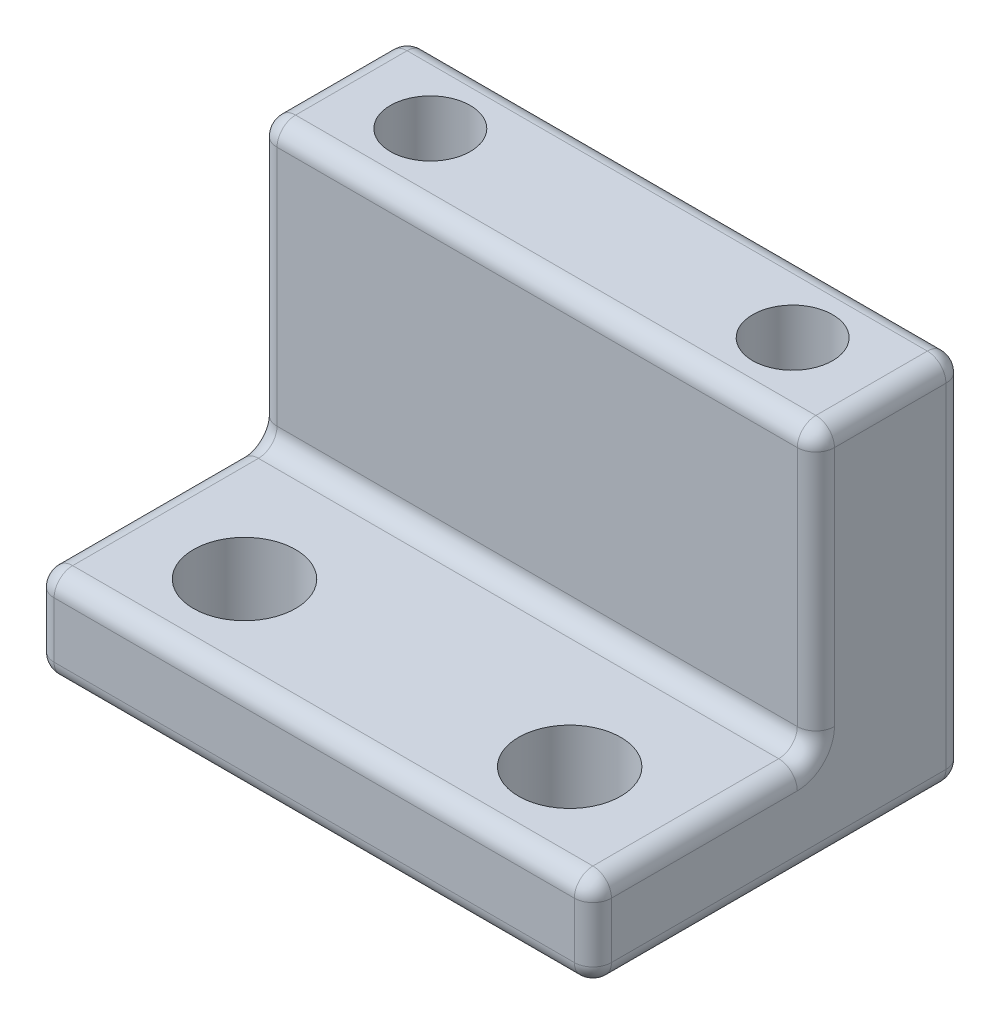
ISO-10303-21;
HEADER;
FILE_DESCRIPTION(('STEP AP214'),'2;1');
FILE_NAME('part.step','',(''),(''),'','','');
FILE_SCHEMA(('AUTOMOTIVE_DESIGN { 1 0 10303 214 1 1 1 1 }'));
ENDSEC;
DATA;
#1=APPLICATION_CONTEXT('core data for automotive mechanical design processes');
#2=APPLICATION_PROTOCOL_DEFINITION('international standard','automotive_design',2000,#1);
#3=PRODUCT_CONTEXT('',#1,'mechanical');
#4=PRODUCT('Part','Part','',(#3));
#5=PRODUCT_RELATED_PRODUCT_CATEGORY('part','',(#4));
#6=PRODUCT_DEFINITION_FORMATION('','',#4);
#7=PRODUCT_DEFINITION_CONTEXT('part definition',#1,'design');
#8=PRODUCT_DEFINITION('design','',#6,#7);
#9=PRODUCT_DEFINITION_SHAPE('','',#8);
#10=(LENGTH_UNIT() NAMED_UNIT(*) SI_UNIT(.MILLI.,.METRE.));
#11=(NAMED_UNIT(*) PLANE_ANGLE_UNIT() SI_UNIT($,.RADIAN.));
#12=(NAMED_UNIT(*) SI_UNIT($,.STERADIAN.) SOLID_ANGLE_UNIT());
#13=UNCERTAINTY_MEASURE_WITH_UNIT(LENGTH_MEASURE(1.E-05),#10,'distance_accuracy_value','');
#14=(GEOMETRIC_REPRESENTATION_CONTEXT(3) GLOBAL_UNCERTAINTY_ASSIGNED_CONTEXT((#13)) GLOBAL_UNIT_ASSIGNED_CONTEXT((#10,
#11,#12)) REPRESENTATION_CONTEXT('',''));
#15=CARTESIAN_POINT('',(0.,0.,0.));
#16=DIRECTION('',(0.,0.,1.));
#17=DIRECTION('',(1.,0.,0.));
#18=AXIS2_PLACEMENT_3D('',#15,#16,#17);
#19=CARTESIAN_POINT('',(0.,5.,0.));
#20=DIRECTION('',(0.,-1.,0.));
#21=DIRECTION('',(0.,0.,-1.));
#22=AXIS2_PLACEMENT_3D('',#19,#20,#21);
#23=PLANE('',#22);
#24=DIRECTION('',(1.,0.,0.));
#25=VECTOR('',#24,1.);
#26=CARTESIAN_POINT('',(0.,5.,-1.));
#27=LINE('',#26,#25);
#28=CARTESIAN_POINT('',(1.,5.,-1.));
#29=VERTEX_POINT('',#28);
#30=CARTESIAN_POINT('',(29.,5.,-1.));
#31=VERTEX_POINT('',#30);
#32=EDGE_CURVE('E185',#29,#31,#27,.T.);
#33=ORIENTED_EDGE('',*,*,#32,.T.);
#34=DIRECTION('',(0.,0.,-1.));
#35=VECTOR('',#34,1.);
#36=CARTESIAN_POINT('',(29.,5.,0.));
#37=LINE('',#36,#35);
#38=CARTESIAN_POINT('',(29.,5.,-11.));
#39=VERTEX_POINT('',#38);
#40=EDGE_CURVE('E180',#31,#39,#37,.T.);
#41=ORIENTED_EDGE('',*,*,#40,.T.);
#42=DIRECTION('',(1.,0.,0.));
#43=VECTOR('',#42,1.);
#44=CARTESIAN_POINT('',(0.,5.,-11.));
#45=LINE('',#44,#43);
#46=CARTESIAN_POINT('',(1.,5.,-11.));
#47=VERTEX_POINT('',#46);
#48=EDGE_CURVE('E172',#39,#47,#45,.F.);
#49=ORIENTED_EDGE('',*,*,#48,.T.);
#50=DIRECTION('',(0.,0.,1.));
#51=VECTOR('',#50,1.);
#52=CARTESIAN_POINT('',(1.,5.,0.));
#53=LINE('',#52,#51);
#54=EDGE_CURVE('E177',#47,#29,#53,.T.);
#55=ORIENTED_EDGE('',*,*,#54,.T.);
#56=EDGE_LOOP('',(#33,#41,#49,#55));
#57=FACE_BOUND('',#56,.T.);
#58=CARTESIAN_POINT('',(23.75,5.,-5.));
#59=DIRECTION('',(0.,1.,0.));
#60=DIRECTION('',(0.,0.,1.));
#61=AXIS2_PLACEMENT_3D('',#58,#59,#60);
#62=CIRCLE('',#61,2.75);
#63=CARTESIAN_POINT('',(23.75,5.,-2.25));
#64=VERTEX_POINT('',#63);
#65=EDGE_CURVE('E474',#64,#64,#62,.T.);
#66=ORIENTED_EDGE('',*,*,#65,.F.);
#67=EDGE_LOOP('',(#66));
#68=FACE_BOUND('',#67,.T.);
#69=CARTESIAN_POINT('',(6.25,5.,-5.));
#70=DIRECTION('',(0.,1.,0.));
#71=DIRECTION('',(0.,0.,1.));
#72=AXIS2_PLACEMENT_3D('',#69,#70,#71);
#73=CIRCLE('',#72,2.75);
#74=CARTESIAN_POINT('',(6.25,5.,-2.25));
#75=VERTEX_POINT('',#74);
#76=EDGE_CURVE('E214',#75,#75,#73,.T.);
#77=ORIENTED_EDGE('',*,*,#76,.F.);
#78=EDGE_LOOP('',(#77));
#79=FACE_BOUND('',#78,.T.);
#80=ADVANCED_FACE('F43',(#57,#68,#79),#23,.F.);
#81=CARTESIAN_POINT('',(0.,0.,0.));
#82=DIRECTION('',(0.,-1.,0.));
#83=DIRECTION('',(0.,0.,-1.));
#84=AXIS2_PLACEMENT_3D('',#81,#82,#83);
#85=PLANE('',#84);
#86=DIRECTION('',(-1.,0.,0.));
#87=VECTOR('',#86,1.);
#88=CARTESIAN_POINT('',(30.,0.,-19.));
#89=LINE('',#88,#87);
#90=CARTESIAN_POINT('',(1.,0.,-19.));
#91=VERTEX_POINT('',#90);
#92=CARTESIAN_POINT('',(29.,0.,-19.));
#93=VERTEX_POINT('',#92);
#94=EDGE_CURVE('E243',#91,#93,#89,.F.);
#95=ORIENTED_EDGE('',*,*,#94,.T.);
#96=DIRECTION('',(0.,0.,-1.));
#97=VECTOR('',#96,1.);
#98=CARTESIAN_POINT('',(29.,0.,0.));
#99=LINE('',#98,#97);
#100=CARTESIAN_POINT('',(29.,0.,-1.));
#101=VERTEX_POINT('',#100);
#102=EDGE_CURVE('E250',#93,#101,#99,.F.);
#103=ORIENTED_EDGE('',*,*,#102,.T.);
#104=DIRECTION('',(1.,0.,0.));
#105=VECTOR('',#104,1.);
#106=CARTESIAN_POINT('',(0.,0.,-1.));
#107=LINE('',#106,#105);
#108=CARTESIAN_POINT('',(1.,0.,-1.));
#109=VERTEX_POINT('',#108);
#110=EDGE_CURVE('E246',#101,#109,#107,.F.);
#111=ORIENTED_EDGE('',*,*,#110,.T.);
#112=DIRECTION('',(0.,0.,1.));
#113=VECTOR('',#112,1.);
#114=CARTESIAN_POINT('',(1.,0.,-20.));
#115=LINE('',#114,#113);
#116=EDGE_CURVE('E240',#109,#91,#115,.F.);
#117=ORIENTED_EDGE('',*,*,#116,.T.);
#118=EDGE_LOOP('',(#95,#103,#111,#117));
#119=FACE_BOUND('',#118,.T.);
#120=CARTESIAN_POINT('',(6.25,0.,-5.));
#121=DIRECTION('',(0.,1.,0.));
#122=DIRECTION('',(0.,0.,1.));
#123=AXIS2_PLACEMENT_3D('',#120,#121,#122);
#124=CIRCLE('',#123,2.75);
#125=CARTESIAN_POINT('',(6.25,0.,-2.25));
#126=VERTEX_POINT('',#125);
#127=EDGE_CURVE('E219',#126,#126,#124,.T.);
#128=ORIENTED_EDGE('',*,*,#127,.T.);
#129=EDGE_LOOP('',(#128));
#130=FACE_BOUND('',#129,.T.);
#131=CARTESIAN_POINT('',(23.75,0.,-5.));
#132=DIRECTION('',(0.,1.,0.));
#133=DIRECTION('',(0.,0.,1.));
#134=AXIS2_PLACEMENT_3D('',#131,#132,#133);
#135=CIRCLE('',#134,2.75);
#136=CARTESIAN_POINT('',(23.75,0.,-2.25));
#137=VERTEX_POINT('',#136);
#138=EDGE_CURVE('E478',#137,#137,#135,.T.);
#139=ORIENTED_EDGE('',*,*,#138,.T.);
#140=EDGE_LOOP('',(#139));
#141=FACE_BOUND('',#140,.T.);
#142=ADVANCED_FACE('F518',(#119,#130,#141),#85,.T.);
#143=CARTESIAN_POINT('',(0.,5.,0.));
#144=DIRECTION('',(1.,0.,0.));
#145=DIRECTION('',(0.,0.,-1.));
#146=AXIS2_PLACEMENT_3D('',#143,#144,#145);
#147=PLANE('',#146);
#148=DIRECTION('',(0.,-1.,0.));
#149=VECTOR('',#148,1.);
#150=CARTESIAN_POINT('',(0.,5.,-13.));
#151=LINE('',#150,#149);
#152=CARTESIAN_POINT('',(0.,6.,-13.));
#153=VERTEX_POINT('',#152);
#154=CARTESIAN_POINT('',(0.,19.,-13.));
#155=VERTEX_POINT('',#154);
#156=EDGE_CURVE('E53',#153,#155,#151,.F.);
#157=ORIENTED_EDGE('',*,*,#156,.T.);
#158=DIRECTION('',(0.,0.,1.));
#159=VECTOR('',#158,1.);
#160=CARTESIAN_POINT('',(0.,19.,-20.));
#161=LINE('',#160,#159);
#162=CARTESIAN_POINT('',(0.,19.,-19.));
#163=VERTEX_POINT('',#162);
#164=EDGE_CURVE('E11',#155,#163,#161,.F.);
#165=ORIENTED_EDGE('',*,*,#164,.T.);
#166=DIRECTION('',(0.,-1.,0.));
#167=VECTOR('',#166,1.);
#168=CARTESIAN_POINT('',(0.,5.,-19.));
#169=LINE('',#168,#167);
#170=CARTESIAN_POINT('',(0.,1.,-19.));
#171=VERTEX_POINT('',#170);
#172=EDGE_CURVE('E323',#163,#171,#169,.T.);
#173=ORIENTED_EDGE('',*,*,#172,.T.);
#174=DIRECTION('',(0.,0.,1.));
#175=VECTOR('',#174,1.);
#176=CARTESIAN_POINT('',(0.,1.,0.));
#177=LINE('',#176,#175);
#178=CARTESIAN_POINT('',(0.,1.,-1.));
#179=VERTEX_POINT('',#178);
#180=EDGE_CURVE('E314',#171,#179,#177,.T.);
#181=ORIENTED_EDGE('',*,*,#180,.T.);
#182=DIRECTION('',(0.,-1.,0.));
#183=VECTOR('',#182,1.);
#184=CARTESIAN_POINT('',(0.,5.,-1.));
#185=LINE('',#184,#183);
#186=CARTESIAN_POINT('',(0.,4.,-1.));
#187=VERTEX_POINT('',#186);
#188=EDGE_CURVE('E317',#179,#187,#185,.F.);
#189=ORIENTED_EDGE('',*,*,#188,.T.);
#190=DIRECTION('',(0.,0.,1.));
#191=VECTOR('',#190,1.);
#192=CARTESIAN_POINT('',(0.,4.,0.));
#193=LINE('',#192,#191);
#194=CARTESIAN_POINT('',(0.,4.,-11.));
#195=VERTEX_POINT('',#194);
#196=EDGE_CURVE('E320',#187,#195,#193,.F.);
#197=ORIENTED_EDGE('',*,*,#196,.T.);
#198=CARTESIAN_POINT('',(0.,6.,-11.));
#199=DIRECTION('',(1.,0.,0.));
#200=DIRECTION('',(0.,0.,-1.));
#201=AXIS2_PLACEMENT_3D('',#198,#199,#200);
#202=CIRCLE('',#201,2.);
#203=EDGE_CURVE('E64',#153,#195,#202,.F.);
#204=ORIENTED_EDGE('',*,*,#203,.F.);
#205=EDGE_LOOP('',(#157,#165,#173,#181,#189,#197,#204));
#206=FACE_BOUND('',#205,.T.);
#207=ADVANCED_FACE('F524',(#206),#147,.F.);
#208=CARTESIAN_POINT('',(0.,5.,0.));
#209=DIRECTION('',(0.,0.,-1.));
#210=DIRECTION('',(-1.,0.,0.));
#211=AXIS2_PLACEMENT_3D('',#208,#209,#210);
#212=PLANE('',#211);
#213=DIRECTION('',(1.,0.,0.));
#214=VECTOR('',#213,1.);
#215=CARTESIAN_POINT('',(30.,1.,0.));
#216=LINE('',#215,#214);
#217=CARTESIAN_POINT('',(1.,1.,0.));
#218=VERTEX_POINT('',#217);
#219=CARTESIAN_POINT('',(29.,1.,0.));
#220=VERTEX_POINT('',#219);
#221=EDGE_CURVE('E230',#218,#220,#216,.T.);
#222=ORIENTED_EDGE('',*,*,#221,.T.);
#223=DIRECTION('',(0.,-1.,0.));
#224=VECTOR('',#223,1.);
#225=CARTESIAN_POINT('',(29.,5.,0.));
#226=LINE('',#225,#224);
#227=CARTESIAN_POINT('',(29.,4.,0.));
#228=VERTEX_POINT('',#227);
#229=EDGE_CURVE('E237',#220,#228,#226,.F.);
#230=ORIENTED_EDGE('',*,*,#229,.T.);
#231=DIRECTION('',(1.,0.,0.));
#232=VECTOR('',#231,1.);
#233=CARTESIAN_POINT('',(0.,4.,0.));
#234=LINE('',#233,#232);
#235=CARTESIAN_POINT('',(1.,4.,0.));
#236=VERTEX_POINT('',#235);
#237=EDGE_CURVE('E233',#228,#236,#234,.F.);
#238=ORIENTED_EDGE('',*,*,#237,.T.);
#239=DIRECTION('',(0.,-1.,0.));
#240=VECTOR('',#239,1.);
#241=CARTESIAN_POINT('',(1.,5.,0.));
#242=LINE('',#241,#240);
#243=EDGE_CURVE('E227',#236,#218,#242,.T.);
#244=ORIENTED_EDGE('',*,*,#243,.T.);
#245=EDGE_LOOP('',(#222,#230,#238,#244));
#246=FACE_BOUND('',#245,.T.);
#247=ADVANCED_FACE('F538',(#246),#212,.F.);
#248=CARTESIAN_POINT('',(30.,5.,0.));
#249=DIRECTION('',(-1.,0.,0.));
#250=DIRECTION('',(0.,0.,1.));
#251=AXIS2_PLACEMENT_3D('',#248,#249,#250);
#252=PLANE('',#251);
#253=CARTESIAN_POINT('',(30.,6.,-11.));
#254=DIRECTION('',(-1.,0.,0.));
#255=DIRECTION('',(0.,0.,1.));
#256=AXIS2_PLACEMENT_3D('',#253,#254,#255);
#257=CIRCLE('',#256,2.);
#258=CARTESIAN_POINT('',(30.,4.,-11.));
#259=VERTEX_POINT('',#258);
#260=CARTESIAN_POINT('',(30.,6.,-13.));
#261=VERTEX_POINT('',#260);
#262=EDGE_CURVE('E307',#259,#261,#257,.F.);
#263=ORIENTED_EDGE('',*,*,#262,.F.);
#264=DIRECTION('',(0.,0.,-1.));
#265=VECTOR('',#264,1.);
#266=CARTESIAN_POINT('',(30.,4.,0.));
#267=LINE('',#266,#265);
#268=CARTESIAN_POINT('',(30.,4.,-1.));
#269=VERTEX_POINT('',#268);
#270=EDGE_CURVE('E311',#259,#269,#267,.F.);
#271=ORIENTED_EDGE('',*,*,#270,.T.);
#272=DIRECTION('',(0.,-1.,0.));
#273=VECTOR('',#272,1.);
#274=CARTESIAN_POINT('',(30.,5.,-1.));
#275=LINE('',#274,#273);
#276=CARTESIAN_POINT('',(30.,1.,-1.));
#277=VERTEX_POINT('',#276);
#278=EDGE_CURVE('E303',#269,#277,#275,.T.);
#279=ORIENTED_EDGE('',*,*,#278,.T.);
#280=DIRECTION('',(0.,0.,-1.));
#281=VECTOR('',#280,1.);
#282=CARTESIAN_POINT('',(30.,1.,-20.));
#283=LINE('',#282,#281);
#284=CARTESIAN_POINT('',(30.,1.,-19.));
#285=VERTEX_POINT('',#284);
#286=EDGE_CURVE('E291',#277,#285,#283,.T.);
#287=ORIENTED_EDGE('',*,*,#286,.T.);
#288=DIRECTION('',(0.,-1.,0.));
#289=VECTOR('',#288,1.);
#290=CARTESIAN_POINT('',(30.,5.,-19.));
#291=LINE('',#290,#289);
#292=CARTESIAN_POINT('',(30.,19.,-19.));
#293=VERTEX_POINT('',#292);
#294=EDGE_CURVE('E294',#285,#293,#291,.F.);
#295=ORIENTED_EDGE('',*,*,#294,.T.);
#296=DIRECTION('',(0.,0.,-1.));
#297=VECTOR('',#296,1.);
#298=CARTESIAN_POINT('',(30.,19.,-12.));
#299=LINE('',#298,#297);
#300=CARTESIAN_POINT('',(30.,19.,-13.));
#301=VERTEX_POINT('',#300);
#302=EDGE_CURVE('E297',#293,#301,#299,.F.);
#303=ORIENTED_EDGE('',*,*,#302,.T.);
#304=DIRECTION('',(0.,-1.,0.));
#305=VECTOR('',#304,1.);
#306=CARTESIAN_POINT('',(30.,5.,-13.));
#307=LINE('',#306,#305);
#308=EDGE_CURVE('E300',#301,#261,#307,.T.);
#309=ORIENTED_EDGE('',*,*,#308,.T.);
#310=EDGE_LOOP('',(#263,#271,#279,#287,#295,#303,#309));
#311=FACE_BOUND('',#310,.T.);
#312=ADVANCED_FACE('F534',(#311),#252,.F.);
#313=CARTESIAN_POINT('',(0.,5.,-20.));
#314=DIRECTION('',(0.,0.,1.));
#315=DIRECTION('',(1.,0.,0.));
#316=AXIS2_PLACEMENT_3D('',#313,#314,#315);
#317=PLANE('',#316);
#318=DIRECTION('',(-1.,0.,0.));
#319=VECTOR('',#318,1.);
#320=CARTESIAN_POINT('',(30.,19.,-20.));
#321=LINE('',#320,#319);
#322=CARTESIAN_POINT('',(1.,19.,-20.));
#323=VERTEX_POINT('',#322);
#324=CARTESIAN_POINT('',(29.,19.,-20.));
#325=VERTEX_POINT('',#324);
#326=EDGE_CURVE('E284',#323,#325,#321,.F.);
#327=ORIENTED_EDGE('',*,*,#326,.T.);
#328=DIRECTION('',(0.,-1.,0.));
#329=VECTOR('',#328,1.);
#330=CARTESIAN_POINT('',(29.,5.,-20.));
#331=LINE('',#330,#329);
#332=CARTESIAN_POINT('',(29.,1.,-20.));
#333=VERTEX_POINT('',#332);
#334=EDGE_CURVE('E288',#325,#333,#331,.T.);
#335=ORIENTED_EDGE('',*,*,#334,.T.);
#336=DIRECTION('',(-1.,0.,0.));
#337=VECTOR('',#336,1.);
#338=CARTESIAN_POINT('',(0.,1.,-20.));
#339=LINE('',#338,#337);
#340=CARTESIAN_POINT('',(1.,1.,-20.));
#341=VERTEX_POINT('',#340);
#342=EDGE_CURVE('E281',#333,#341,#339,.T.);
#343=ORIENTED_EDGE('',*,*,#342,.T.);
#344=DIRECTION('',(0.,-1.,0.));
#345=VECTOR('',#344,1.);
#346=CARTESIAN_POINT('',(1.,5.,-20.));
#347=LINE('',#346,#345);
#348=EDGE_CURVE('E278',#341,#323,#347,.F.);
#349=ORIENTED_EDGE('',*,*,#348,.T.);
#350=EDGE_LOOP('',(#327,#335,#343,#349));
#351=FACE_BOUND('',#350,.T.);
#352=ADVANCED_FACE('F531',(#351),#317,.F.);
#353=CARTESIAN_POINT('',(6.25,5.,-5.));
#354=DIRECTION('',(0.,-1.,0.));
#355=DIRECTION('',(0.,0.,-1.));
#356=AXIS2_PLACEMENT_3D('',#353,#354,#355);
#357=CYLINDRICAL_SURFACE('',#356,2.75);
#358=ORIENTED_EDGE('',*,*,#76,.T.);
#359=EDGE_LOOP('',(#358));
#360=FACE_BOUND('',#359,.T.);
#361=ORIENTED_EDGE('',*,*,#127,.F.);
#362=EDGE_LOOP('',(#361));
#363=FACE_BOUND('',#362,.T.);
#364=ADVANCED_FACE('F528',(#360,#363),#357,.F.);
#365=CARTESIAN_POINT('',(23.75,5.,-5.));
#366=DIRECTION('',(0.,-1.,0.));
#367=DIRECTION('',(0.,0.,-1.));
#368=AXIS2_PLACEMENT_3D('',#365,#366,#367);
#369=CYLINDRICAL_SURFACE('',#368,2.75);
#370=ORIENTED_EDGE('',*,*,#65,.T.);
#371=EDGE_LOOP('',(#370));
#372=FACE_BOUND('',#371,.T.);
#373=ORIENTED_EDGE('',*,*,#138,.F.);
#374=EDGE_LOOP('',(#373));
#375=FACE_BOUND('',#374,.T.);
#376=ADVANCED_FACE('F716',(#372,#375),#369,.F.);
#377=CARTESIAN_POINT('',(0.,20.,-12.));
#378=DIRECTION('',(0.,0.,-1.));
#379=DIRECTION('',(-1.,0.,0.));
#380=AXIS2_PLACEMENT_3D('',#377,#378,#379);
#381=PLANE('',#380);
#382=DIRECTION('',(1.,0.,0.));
#383=VECTOR('',#382,1.);
#384=CARTESIAN_POINT('',(30.,6.,-12.));
#385=LINE('',#384,#383);
#386=CARTESIAN_POINT('',(1.,6.,-12.));
#387=VERTEX_POINT('',#386);
#388=CARTESIAN_POINT('',(29.,6.,-12.));
#389=VERTEX_POINT('',#388);
#390=EDGE_CURVE('E192',#387,#389,#385,.T.);
#391=ORIENTED_EDGE('',*,*,#390,.T.);
#392=DIRECTION('',(0.,-1.,0.));
#393=VECTOR('',#392,1.);
#394=CARTESIAN_POINT('',(29.,20.,-12.));
#395=LINE('',#394,#393);
#396=CARTESIAN_POINT('',(29.,19.,-12.));
#397=VERTEX_POINT('',#396);
#398=EDGE_CURVE('E275',#389,#397,#395,.F.);
#399=ORIENTED_EDGE('',*,*,#398,.T.);
#400=DIRECTION('',(1.,0.,0.));
#401=VECTOR('',#400,1.);
#402=CARTESIAN_POINT('',(0.,19.,-12.));
#403=LINE('',#402,#401);
#404=CARTESIAN_POINT('',(1.,19.,-12.));
#405=VERTEX_POINT('',#404);
#406=EDGE_CURVE('E271',#397,#405,#403,.F.);
#407=ORIENTED_EDGE('',*,*,#406,.T.);
#408=DIRECTION('',(0.,-1.,0.));
#409=VECTOR('',#408,1.);
#410=CARTESIAN_POINT('',(1.,20.,-12.));
#411=LINE('',#410,#409);
#412=EDGE_CURVE('E266',#405,#387,#411,.T.);
#413=ORIENTED_EDGE('',*,*,#412,.T.);
#414=EDGE_LOOP('',(#391,#399,#407,#413));
#415=FACE_BOUND('',#414,.T.);
#416=ADVANCED_FACE('F502',(#415),#381,.F.);
#417=CARTESIAN_POINT('',(0.,20.,0.));
#418=DIRECTION('',(0.,1.,0.));
#419=DIRECTION('',(0.,0.,1.));
#420=AXIS2_PLACEMENT_3D('',#417,#418,#419);
#421=PLANE('',#420);
#422=DIRECTION('',(1.,0.,0.));
#423=VECTOR('',#422,1.);
#424=CARTESIAN_POINT('',(30.,20.,-13.));
#425=LINE('',#424,#423);
#426=CARTESIAN_POINT('',(1.,20.,-13.));
#427=VERTEX_POINT('',#426);
#428=CARTESIAN_POINT('',(29.,20.,-13.));
#429=VERTEX_POINT('',#428);
#430=EDGE_CURVE('E259',#427,#429,#425,.T.);
#431=ORIENTED_EDGE('',*,*,#430,.T.);
#432=DIRECTION('',(0.,0.,-1.));
#433=VECTOR('',#432,1.);
#434=CARTESIAN_POINT('',(29.,20.,-20.));
#435=LINE('',#434,#433);
#436=CARTESIAN_POINT('',(29.,20.,-19.));
#437=VERTEX_POINT('',#436);
#438=EDGE_CURVE('E263',#429,#437,#435,.T.);
#439=ORIENTED_EDGE('',*,*,#438,.T.);
#440=DIRECTION('',(-1.,0.,0.));
#441=VECTOR('',#440,1.);
#442=CARTESIAN_POINT('',(0.,20.,-19.));
#443=LINE('',#442,#441);
#444=CARTESIAN_POINT('',(1.,20.,-19.));
#445=VERTEX_POINT('',#444);
#446=EDGE_CURVE('E256',#437,#445,#443,.T.);
#447=ORIENTED_EDGE('',*,*,#446,.T.);
#448=DIRECTION('',(0.,0.,1.));
#449=VECTOR('',#448,1.);
#450=CARTESIAN_POINT('',(1.,20.,-12.));
#451=LINE('',#450,#449);
#452=EDGE_CURVE('E253',#445,#427,#451,.T.);
#453=ORIENTED_EDGE('',*,*,#452,.T.);
#454=EDGE_LOOP('',(#431,#439,#447,#453));
#455=FACE_BOUND('',#454,.T.);
#456=CARTESIAN_POINT('',(5.25,20.,-16.));
#457=DIRECTION('',(0.,1.,0.));
#458=DIRECTION('',(0.,0.,1.));
#459=AXIS2_PLACEMENT_3D('',#456,#457,#458);
#460=CIRCLE('',#459,2.15);
#461=CARTESIAN_POINT('',(5.25,20.,-13.85));
#462=VERTEX_POINT('',#461);
#463=EDGE_CURVE('E470',#462,#462,#460,.T.);
#464=ORIENTED_EDGE('',*,*,#463,.F.);
#465=EDGE_LOOP('',(#464));
#466=FACE_BOUND('',#465,.T.);
#467=CARTESIAN_POINT('',(24.75,20.,-16.));
#468=DIRECTION('',(0.,1.,0.));
#469=DIRECTION('',(0.,0.,1.));
#470=AXIS2_PLACEMENT_3D('',#467,#468,#469);
#471=CIRCLE('',#470,2.15);
#472=CARTESIAN_POINT('',(24.75,20.,-13.85));
#473=VERTEX_POINT('',#472);
#474=EDGE_CURVE('E463',#473,#473,#471,.T.);
#475=ORIENTED_EDGE('',*,*,#474,.F.);
#476=EDGE_LOOP('',(#475));
#477=FACE_BOUND('',#476,.T.);
#478=ADVANCED_FACE('F498',(#455,#466,#477),#421,.T.);
#479=CARTESIAN_POINT('',(24.75,14.,-16.));
#480=DIRECTION('',(0.,1.,0.));
#481=DIRECTION('',(0.,0.,1.));
#482=AXIS2_PLACEMENT_3D('',#479,#480,#481);
#483=CYLINDRICAL_SURFACE('',#482,2.15);
#484=CARTESIAN_POINT('',(24.75,14.,-16.));
#485=DIRECTION('',(0.,1.,0.));
#486=DIRECTION('',(0.,0.,1.));
#487=AXIS2_PLACEMENT_3D('',#484,#485,#486);
#488=CIRCLE('',#487,2.15);
#489=CARTESIAN_POINT('',(24.75,14.,-13.85));
#490=VERTEX_POINT('',#489);
#491=EDGE_CURVE('E455',#490,#490,#488,.T.);
#492=ORIENTED_EDGE('',*,*,#491,.F.);
#493=EDGE_LOOP('',(#492));
#494=FACE_BOUND('',#493,.T.);
#495=ORIENTED_EDGE('',*,*,#474,.T.);
#496=EDGE_LOOP('',(#495));
#497=FACE_BOUND('',#496,.T.);
#498=ADVANCED_FACE('F501',(#494,#497),#483,.F.);
#499=CARTESIAN_POINT('',(24.75,14.,-16.));
#500=DIRECTION('',(0.,1.,0.));
#501=DIRECTION('',(0.,0.,1.));
#502=AXIS2_PLACEMENT_3D('',#499,#500,#501);
#503=PLANE('',#502);
#504=ORIENTED_EDGE('',*,*,#491,.T.);
#505=EDGE_LOOP('',(#504));
#506=FACE_BOUND('',#505,.T.);
#507=ADVANCED_FACE('F508',(#506),#503,.T.);
#508=CARTESIAN_POINT('',(5.25,14.,-16.));
#509=DIRECTION('',(0.,1.,0.));
#510=DIRECTION('',(0.,0.,1.));
#511=AXIS2_PLACEMENT_3D('',#508,#509,#510);
#512=CYLINDRICAL_SURFACE('',#511,2.15);
#513=CARTESIAN_POINT('',(5.25,14.,-16.));
#514=DIRECTION('',(0.,1.,0.));
#515=DIRECTION('',(0.,0.,1.));
#516=AXIS2_PLACEMENT_3D('',#513,#514,#515);
#517=CIRCLE('',#516,2.15);
#518=CARTESIAN_POINT('',(5.25,14.,-13.85));
#519=VERTEX_POINT('',#518);
#520=EDGE_CURVE('E481',#519,#519,#517,.T.);
#521=ORIENTED_EDGE('',*,*,#520,.F.);
#522=EDGE_LOOP('',(#521));
#523=FACE_BOUND('',#522,.T.);
#524=ORIENTED_EDGE('',*,*,#463,.T.);
#525=EDGE_LOOP('',(#524));
#526=FACE_BOUND('',#525,.T.);
#527=ADVANCED_FACE('F496',(#523,#526),#512,.F.);
#528=CARTESIAN_POINT('',(5.25,14.,-16.));
#529=DIRECTION('',(0.,1.,0.));
#530=DIRECTION('',(0.,0.,1.));
#531=AXIS2_PLACEMENT_3D('',#528,#529,#530);
#532=PLANE('',#531);
#533=ORIENTED_EDGE('',*,*,#520,.T.);
#534=EDGE_LOOP('',(#533));
#535=FACE_BOUND('',#534,.T.);
#536=ADVANCED_FACE('F654',(#535),#532,.T.);
#537=CARTESIAN_POINT('',(0.,19.,-19.));
#538=DIRECTION('',(1.,0.,0.));
#539=DIRECTION('',(0.,0.,-1.));
#540=AXIS2_PLACEMENT_3D('',#537,#538,#539);
#541=CYLINDRICAL_SURFACE('',#540,1.);
#542=CARTESIAN_POINT('',(1.,19.,-19.));
#543=DIRECTION('',(-1.,0.,0.));
#544=DIRECTION('',(0.,0.,1.));
#545=AXIS2_PLACEMENT_3D('',#542,#543,#544);
#546=CIRCLE('',#545,1.);
#547=EDGE_CURVE('E47',#445,#323,#546,.T.);
#548=ORIENTED_EDGE('',*,*,#547,.F.);
#549=ORIENTED_EDGE('',*,*,#446,.F.);
#550=CARTESIAN_POINT('',(29.,19.,-19.));
#551=DIRECTION('',(1.,0.,0.));
#552=DIRECTION('',(0.,0.,-1.));
#553=AXIS2_PLACEMENT_3D('',#550,#551,#552);
#554=CIRCLE('',#553,1.);
#555=EDGE_CURVE('E445',#325,#437,#554,.T.);
#556=ORIENTED_EDGE('',*,*,#555,.F.);
#557=ORIENTED_EDGE('',*,*,#326,.F.);
#558=EDGE_LOOP('',(#548,#549,#556,#557));
#559=FACE_BOUND('',#558,.T.);
#560=ADVANCED_FACE('F45',(#559),#541,.T.);
#561=CARTESIAN_POINT('',(1.,19.,-19.));
#562=DIRECTION('',(0.,0.,-1.));
#563=DIRECTION('',(-1.,0.,0.));
#564=AXIS2_PLACEMENT_3D('',#561,#562,#563);
#565=SPHERICAL_SURFACE('',#564,1.);
#566=CARTESIAN_POINT('',(1.,19.,-19.));
#567=DIRECTION('',(0.,0.,-1.));
#568=DIRECTION('',(-1.,0.,0.));
#569=AXIS2_PLACEMENT_3D('',#566,#567,#568);
#570=CIRCLE('',#569,1.);
#571=EDGE_CURVE('E438',#445,#163,#570,.F.);
#572=ORIENTED_EDGE('',*,*,#571,.F.);
#573=ORIENTED_EDGE('',*,*,#547,.T.);
#574=CARTESIAN_POINT('',(1.,19.,-19.));
#575=DIRECTION('',(0.,1.,0.));
#576=DIRECTION('',(0.,0.,1.));
#577=AXIS2_PLACEMENT_3D('',#574,#575,#576);
#578=CIRCLE('',#577,1.);
#579=EDGE_CURVE('E442',#163,#323,#578,.F.);
#580=ORIENTED_EDGE('',*,*,#579,.F.);
#581=EDGE_LOOP('',(#572,#573,#580));
#582=FACE_BOUND('',#581,.T.);
#583=ADVANCED_FACE('F649',(#582),#565,.T.);
#584=CARTESIAN_POINT('',(29.,19.,-19.));
#585=DIRECTION('',(0.,1.,0.));
#586=DIRECTION('',(0.,0.,1.));
#587=AXIS2_PLACEMENT_3D('',#584,#585,#586);
#588=SPHERICAL_SURFACE('',#587,1.);
#589=CARTESIAN_POINT('',(29.,19.,-19.));
#590=DIRECTION('',(0.,1.,0.));
#591=DIRECTION('',(0.,0.,1.));
#592=AXIS2_PLACEMENT_3D('',#589,#590,#591);
#593=CIRCLE('',#592,1.);
#594=EDGE_CURVE('E430',#325,#293,#593,.F.);
#595=ORIENTED_EDGE('',*,*,#594,.F.);
#596=ORIENTED_EDGE('',*,*,#555,.T.);
#597=CARTESIAN_POINT('',(29.,19.,-19.));
#598=DIRECTION('',(0.,0.,-1.));
#599=DIRECTION('',(-1.,0.,0.));
#600=AXIS2_PLACEMENT_3D('',#597,#598,#599);
#601=CIRCLE('',#600,1.);
#602=EDGE_CURVE('E434',#293,#437,#601,.F.);
#603=ORIENTED_EDGE('',*,*,#602,.F.);
#604=EDGE_LOOP('',(#595,#596,#603));
#605=FACE_BOUND('',#604,.T.);
#606=ADVANCED_FACE('F646',(#605),#588,.T.);
#607=CARTESIAN_POINT('',(1.,5.,-19.));
#608=DIRECTION('',(0.,-1.,0.));
#609=DIRECTION('',(0.,0.,-1.));
#610=AXIS2_PLACEMENT_3D('',#607,#608,#609);
#611=CYLINDRICAL_SURFACE('',#610,1.);
#612=ORIENTED_EDGE('',*,*,#579,.T.);
#613=ORIENTED_EDGE('',*,*,#348,.F.);
#614=CARTESIAN_POINT('',(1.,1.,-19.));
#615=DIRECTION('',(0.,-1.,0.));
#616=DIRECTION('',(0.,0.,-1.));
#617=AXIS2_PLACEMENT_3D('',#614,#615,#616);
#618=CIRCLE('',#617,1.);
#619=EDGE_CURVE('E422',#171,#341,#618,.T.);
#620=ORIENTED_EDGE('',*,*,#619,.F.);
#621=ORIENTED_EDGE('',*,*,#172,.F.);
#622=EDGE_LOOP('',(#612,#613,#620,#621));
#623=FACE_BOUND('',#622,.T.);
#624=ADVANCED_FACE('F642',(#623),#611,.T.);
#625=CARTESIAN_POINT('',(1.,19.,0.));
#626=DIRECTION('',(0.,0.,-1.));
#627=DIRECTION('',(-1.,0.,0.));
#628=AXIS2_PLACEMENT_3D('',#625,#626,#627);
#629=CYLINDRICAL_SURFACE('',#628,1.);
#630=ORIENTED_EDGE('',*,*,#571,.T.);
#631=ORIENTED_EDGE('',*,*,#164,.F.);
#632=CARTESIAN_POINT('',(1.,19.,-13.));
#633=DIRECTION('',(0.,0.,1.));
#634=DIRECTION('',(1.,0.,0.));
#635=AXIS2_PLACEMENT_3D('',#632,#633,#634);
#636=CIRCLE('',#635,1.);
#637=EDGE_CURVE('E418',#427,#155,#636,.T.);
#638=ORIENTED_EDGE('',*,*,#637,.F.);
#639=ORIENTED_EDGE('',*,*,#452,.F.);
#640=EDGE_LOOP('',(#630,#631,#638,#639));
#641=FACE_BOUND('',#640,.T.);
#642=ADVANCED_FACE('F638',(#641),#629,.T.);
#643=CARTESIAN_POINT('',(0.,19.,-13.));
#644=DIRECTION('',(-1.,0.,0.));
#645=DIRECTION('',(0.,0.,1.));
#646=AXIS2_PLACEMENT_3D('',#643,#644,#645);
#647=CYLINDRICAL_SURFACE('',#646,1.);
#648=CARTESIAN_POINT('',(29.,19.,-13.));
#649=DIRECTION('',(1.,0.,0.));
#650=DIRECTION('',(0.,0.,-1.));
#651=AXIS2_PLACEMENT_3D('',#648,#649,#650);
#652=CIRCLE('',#651,1.);
#653=EDGE_CURVE('E410',#429,#397,#652,.T.);
#654=ORIENTED_EDGE('',*,*,#653,.F.);
#655=ORIENTED_EDGE('',*,*,#430,.F.);
#656=CARTESIAN_POINT('',(1.,19.,-13.));
#657=DIRECTION('',(-1.,0.,0.));
#658=DIRECTION('',(0.,0.,1.));
#659=AXIS2_PLACEMENT_3D('',#656,#657,#658);
#660=CIRCLE('',#659,1.);
#661=EDGE_CURVE('E414',#405,#427,#660,.T.);
#662=ORIENTED_EDGE('',*,*,#661,.F.);
#663=ORIENTED_EDGE('',*,*,#406,.F.);
#664=EDGE_LOOP('',(#654,#655,#662,#663));
#665=FACE_BOUND('',#664,.T.);
#666=ADVANCED_FACE('F634',(#665),#647,.T.);
#667=CARTESIAN_POINT('',(29.,19.,0.));
#668=DIRECTION('',(0.,0.,1.));
#669=DIRECTION('',(1.,0.,0.));
#670=AXIS2_PLACEMENT_3D('',#667,#668,#669);
#671=CYLINDRICAL_SURFACE('',#670,1.);
#672=ORIENTED_EDGE('',*,*,#602,.T.);
#673=ORIENTED_EDGE('',*,*,#438,.F.);
#674=CARTESIAN_POINT('',(29.,19.,-13.));
#675=DIRECTION('',(0.,0.,1.));
#676=DIRECTION('',(1.,0.,0.));
#677=AXIS2_PLACEMENT_3D('',#674,#675,#676);
#678=CIRCLE('',#677,1.);
#679=EDGE_CURVE('E407',#301,#429,#678,.T.);
#680=ORIENTED_EDGE('',*,*,#679,.F.);
#681=ORIENTED_EDGE('',*,*,#302,.F.);
#682=EDGE_LOOP('',(#672,#673,#680,#681));
#683=FACE_BOUND('',#682,.T.);
#684=ADVANCED_FACE('F630',(#683),#671,.T.);
#685=CARTESIAN_POINT('',(29.,5.,-19.));
#686=DIRECTION('',(0.,-1.,0.));
#687=DIRECTION('',(0.,0.,-1.));
#688=AXIS2_PLACEMENT_3D('',#685,#686,#687);
#689=CYLINDRICAL_SURFACE('',#688,1.);
#690=ORIENTED_EDGE('',*,*,#594,.T.);
#691=ORIENTED_EDGE('',*,*,#294,.F.);
#692=CARTESIAN_POINT('',(29.,1.,-19.));
#693=DIRECTION('',(0.,-1.,0.));
#694=DIRECTION('',(0.,0.,-1.));
#695=AXIS2_PLACEMENT_3D('',#692,#693,#694);
#696=CIRCLE('',#695,1.);
#697=EDGE_CURVE('E403',#333,#285,#696,.T.);
#698=ORIENTED_EDGE('',*,*,#697,.F.);
#699=ORIENTED_EDGE('',*,*,#334,.F.);
#700=EDGE_LOOP('',(#690,#691,#698,#699));
#701=FACE_BOUND('',#700,.T.);
#702=ADVANCED_FACE('F626',(#701),#689,.T.);
#703=CARTESIAN_POINT('',(0.,1.,-19.));
#704=DIRECTION('',(1.,0.,0.));
#705=DIRECTION('',(0.,0.,-1.));
#706=AXIS2_PLACEMENT_3D('',#703,#704,#705);
#707=CYLINDRICAL_SURFACE('',#706,1.);
#708=CARTESIAN_POINT('',(1.,1.,-19.));
#709=DIRECTION('',(-1.,0.,0.));
#710=DIRECTION('',(0.,0.,1.));
#711=AXIS2_PLACEMENT_3D('',#708,#709,#710);
#712=CIRCLE('',#711,1.);
#713=EDGE_CURVE('E426',#341,#91,#712,.T.);
#714=ORIENTED_EDGE('',*,*,#713,.F.);
#715=ORIENTED_EDGE('',*,*,#342,.F.);
#716=CARTESIAN_POINT('',(29.,1.,-19.));
#717=DIRECTION('',(1.,0.,0.));
#718=DIRECTION('',(0.,0.,-1.));
#719=AXIS2_PLACEMENT_3D('',#716,#717,#718);
#720=CIRCLE('',#719,1.);
#721=EDGE_CURVE('E399',#93,#333,#720,.T.);
#722=ORIENTED_EDGE('',*,*,#721,.F.);
#723=ORIENTED_EDGE('',*,*,#94,.F.);
#724=EDGE_LOOP('',(#714,#715,#722,#723));
#725=FACE_BOUND('',#724,.T.);
#726=ADVANCED_FACE('F622',(#725),#707,.T.);
#727=CARTESIAN_POINT('',(1.,1.,-19.));
#728=DIRECTION('',(0.,0.,-1.));
#729=DIRECTION('',(-1.,0.,0.));
#730=AXIS2_PLACEMENT_3D('',#727,#728,#729);
#731=SPHERICAL_SURFACE('',#730,1.);
#732=ORIENTED_EDGE('',*,*,#619,.T.);
#733=ORIENTED_EDGE('',*,*,#713,.T.);
#734=CARTESIAN_POINT('',(1.,1.,-19.));
#735=DIRECTION('',(0.,0.,-1.));
#736=DIRECTION('',(-1.,0.,0.));
#737=AXIS2_PLACEMENT_3D('',#734,#735,#736);
#738=CIRCLE('',#737,1.);
#739=EDGE_CURVE('E395',#171,#91,#738,.F.);
#740=ORIENTED_EDGE('',*,*,#739,.F.);
#741=EDGE_LOOP('',(#732,#733,#740));
#742=FACE_BOUND('',#741,.T.);
#743=ADVANCED_FACE('F618',(#742),#731,.T.);
#744=CARTESIAN_POINT('',(1.,19.,-13.));
#745=DIRECTION('',(0.,1.,0.));
#746=DIRECTION('',(0.,0.,1.));
#747=AXIS2_PLACEMENT_3D('',#744,#745,#746);
#748=SPHERICAL_SURFACE('',#747,1.);
#749=ORIENTED_EDGE('',*,*,#661,.T.);
#750=ORIENTED_EDGE('',*,*,#637,.T.);
#751=CARTESIAN_POINT('',(1.,19.,-13.));
#752=DIRECTION('',(0.,1.,0.));
#753=DIRECTION('',(0.,0.,1.));
#754=AXIS2_PLACEMENT_3D('',#751,#752,#753);
#755=CIRCLE('',#754,1.);
#756=EDGE_CURVE('E391',#405,#155,#755,.F.);
#757=ORIENTED_EDGE('',*,*,#756,.F.);
#758=EDGE_LOOP('',(#749,#750,#757));
#759=FACE_BOUND('',#758,.T.);
#760=ADVANCED_FACE('F614',(#759),#748,.T.);
#761=CARTESIAN_POINT('',(29.,19.,-13.));
#762=DIRECTION('',(0.,1.,0.));
#763=DIRECTION('',(0.,0.,1.));
#764=AXIS2_PLACEMENT_3D('',#761,#762,#763);
#765=SPHERICAL_SURFACE('',#764,1.);
#766=ORIENTED_EDGE('',*,*,#679,.T.);
#767=ORIENTED_EDGE('',*,*,#653,.T.);
#768=CARTESIAN_POINT('',(29.,19.,-13.));
#769=DIRECTION('',(0.,1.,0.));
#770=DIRECTION('',(0.,0.,1.));
#771=AXIS2_PLACEMENT_3D('',#768,#769,#770);
#772=CIRCLE('',#771,1.);
#773=EDGE_CURVE('E387',#301,#397,#772,.F.);
#774=ORIENTED_EDGE('',*,*,#773,.F.);
#775=EDGE_LOOP('',(#766,#767,#774));
#776=FACE_BOUND('',#775,.T.);
#777=ADVANCED_FACE('F610',(#776),#765,.T.);
#778=CARTESIAN_POINT('',(29.,1.,-19.));
#779=DIRECTION('',(0.,0.,-1.));
#780=DIRECTION('',(-1.,0.,0.));
#781=AXIS2_PLACEMENT_3D('',#778,#779,#780);
#782=SPHERICAL_SURFACE('',#781,1.);
#783=ORIENTED_EDGE('',*,*,#721,.T.);
#784=ORIENTED_EDGE('',*,*,#697,.T.);
#785=CARTESIAN_POINT('',(29.,1.,-19.));
#786=DIRECTION('',(0.,0.,-1.));
#787=DIRECTION('',(-1.,0.,0.));
#788=AXIS2_PLACEMENT_3D('',#785,#786,#787);
#789=CIRCLE('',#788,1.);
#790=EDGE_CURVE('E383',#93,#285,#789,.F.);
#791=ORIENTED_EDGE('',*,*,#790,.F.);
#792=EDGE_LOOP('',(#783,#784,#791));
#793=FACE_BOUND('',#792,.T.);
#794=ADVANCED_FACE('F606',(#793),#782,.T.);
#795=CARTESIAN_POINT('',(1.,1.,0.));
#796=DIRECTION('',(0.,0.,-1.));
#797=DIRECTION('',(-1.,0.,0.));
#798=AXIS2_PLACEMENT_3D('',#795,#796,#797);
#799=CYLINDRICAL_SURFACE('',#798,1.);
#800=ORIENTED_EDGE('',*,*,#739,.T.);
#801=ORIENTED_EDGE('',*,*,#116,.F.);
#802=CARTESIAN_POINT('',(1.,1.,-1.));
#803=DIRECTION('',(0.,0.,1.));
#804=DIRECTION('',(1.,0.,0.));
#805=AXIS2_PLACEMENT_3D('',#802,#803,#804);
#806=CIRCLE('',#805,1.);
#807=EDGE_CURVE('E376',#179,#109,#806,.T.);
#808=ORIENTED_EDGE('',*,*,#807,.F.);
#809=ORIENTED_EDGE('',*,*,#180,.F.);
#810=EDGE_LOOP('',(#800,#801,#808,#809));
#811=FACE_BOUND('',#810,.T.);
#812=ADVANCED_FACE('F602',(#811),#799,.T.);
#813=CARTESIAN_POINT('',(1.,20.,-13.));
#814=DIRECTION('',(0.,-1.,0.));
#815=DIRECTION('',(0.,0.,-1.));
#816=AXIS2_PLACEMENT_3D('',#813,#814,#815);
#817=CYLINDRICAL_SURFACE('',#816,1.);
#818=ORIENTED_EDGE('',*,*,#756,.T.);
#819=ORIENTED_EDGE('',*,*,#156,.F.);
#820=CARTESIAN_POINT('',(1.,6.,-13.));
#821=DIRECTION('',(0.,-1.,0.));
#822=DIRECTION('',(0.,0.,-1.));
#823=AXIS2_PLACEMENT_3D('',#820,#821,#822);
#824=CIRCLE('',#823,1.);
#825=EDGE_CURVE('E197',#387,#153,#824,.T.);
#826=ORIENTED_EDGE('',*,*,#825,.F.);
#827=ORIENTED_EDGE('',*,*,#412,.F.);
#828=EDGE_LOOP('',(#818,#819,#826,#827));
#829=FACE_BOUND('',#828,.T.);
#830=ADVANCED_FACE('F599',(#829),#817,.T.);
#831=CARTESIAN_POINT('',(0.,6.,-11.));
#832=DIRECTION('',(-1.,0.,0.));
#833=DIRECTION('',(0.,0.,1.));
#834=AXIS2_PLACEMENT_3D('',#831,#832,#833);
#835=CYLINDRICAL_SURFACE('',#834,1.);
#836=CARTESIAN_POINT('',(29.,6.,-11.));
#837=DIRECTION('',(-1.,0.,0.));
#838=DIRECTION('',(0.,0.,1.));
#839=AXIS2_PLACEMENT_3D('',#836,#837,#838);
#840=CIRCLE('',#839,1.);
#841=EDGE_CURVE('E198',#389,#39,#840,.T.);
#842=ORIENTED_EDGE('',*,*,#841,.F.);
#843=ORIENTED_EDGE('',*,*,#390,.F.);
#844=CARTESIAN_POINT('',(1.,6.,-11.));
#845=DIRECTION('',(1.,0.,0.));
#846=DIRECTION('',(0.,0.,-1.));
#847=AXIS2_PLACEMENT_3D('',#844,#845,#846);
#848=CIRCLE('',#847,1.);
#849=EDGE_CURVE('E189',#47,#387,#848,.T.);
#850=ORIENTED_EDGE('',*,*,#849,.F.);
#851=ORIENTED_EDGE('',*,*,#48,.F.);
#852=EDGE_LOOP('',(#842,#843,#850,#851));
#853=FACE_BOUND('',#852,.T.);
#854=ADVANCED_FACE('F191',(#853),#835,.F.);
#855=CARTESIAN_POINT('',(29.,5.,-13.));
#856=DIRECTION('',(0.,-1.,0.));
#857=DIRECTION('',(0.,0.,-1.));
#858=AXIS2_PLACEMENT_3D('',#855,#856,#857);
#859=CYLINDRICAL_SURFACE('',#858,1.);
#860=ORIENTED_EDGE('',*,*,#773,.T.);
#861=ORIENTED_EDGE('',*,*,#398,.F.);
#862=CARTESIAN_POINT('',(29.,6.,-13.));
#863=DIRECTION('',(0.,-1.,0.));
#864=DIRECTION('',(0.,0.,-1.));
#865=AXIS2_PLACEMENT_3D('',#862,#863,#864);
#866=CIRCLE('',#865,1.);
#867=EDGE_CURVE('E368',#261,#389,#866,.T.);
#868=ORIENTED_EDGE('',*,*,#867,.F.);
#869=ORIENTED_EDGE('',*,*,#308,.F.);
#870=EDGE_LOOP('',(#860,#861,#868,#869));
#871=FACE_BOUND('',#870,.T.);
#872=ADVANCED_FACE('F592',(#871),#859,.T.);
#873=CARTESIAN_POINT('',(29.,1.,0.));
#874=DIRECTION('',(0.,0.,1.));
#875=DIRECTION('',(1.,0.,0.));
#876=AXIS2_PLACEMENT_3D('',#873,#874,#875);
#877=CYLINDRICAL_SURFACE('',#876,1.);
#878=ORIENTED_EDGE('',*,*,#790,.T.);
#879=ORIENTED_EDGE('',*,*,#286,.F.);
#880=CARTESIAN_POINT('',(29.,1.,-1.));
#881=DIRECTION('',(0.,0.,1.));
#882=DIRECTION('',(1.,0.,0.));
#883=AXIS2_PLACEMENT_3D('',#880,#881,#882);
#884=CIRCLE('',#883,1.);
#885=EDGE_CURVE('E364',#101,#277,#884,.T.);
#886=ORIENTED_EDGE('',*,*,#885,.F.);
#887=ORIENTED_EDGE('',*,*,#102,.F.);
#888=EDGE_LOOP('',(#878,#879,#886,#887));
#889=FACE_BOUND('',#888,.T.);
#890=ADVANCED_FACE('F588',(#889),#877,.T.);
#891=CARTESIAN_POINT('',(0.,1.,-1.));
#892=DIRECTION('',(-1.,0.,0.));
#893=DIRECTION('',(0.,0.,1.));
#894=AXIS2_PLACEMENT_3D('',#891,#892,#893);
#895=CYLINDRICAL_SURFACE('',#894,1.);
#896=CARTESIAN_POINT('',(1.,1.,-1.));
#897=DIRECTION('',(-1.,0.,0.));
#898=DIRECTION('',(0.,0.,1.));
#899=AXIS2_PLACEMENT_3D('',#896,#897,#898);
#900=CIRCLE('',#899,1.);
#901=EDGE_CURVE('E379',#109,#218,#900,.T.);
#902=ORIENTED_EDGE('',*,*,#901,.F.);
#903=ORIENTED_EDGE('',*,*,#110,.F.);
#904=CARTESIAN_POINT('',(29.,1.,-1.));
#905=DIRECTION('',(1.,0.,0.));
#906=DIRECTION('',(0.,0.,-1.));
#907=AXIS2_PLACEMENT_3D('',#904,#905,#906);
#908=CIRCLE('',#907,1.);
#909=EDGE_CURVE('E360',#220,#101,#908,.T.);
#910=ORIENTED_EDGE('',*,*,#909,.F.);
#911=ORIENTED_EDGE('',*,*,#221,.F.);
#912=EDGE_LOOP('',(#902,#903,#910,#911));
#913=FACE_BOUND('',#912,.T.);
#914=ADVANCED_FACE('F584',(#913),#895,.T.);
#915=CARTESIAN_POINT('',(1.,1.,-1.));
#916=DIRECTION('',(0.,-1.,0.));
#917=DIRECTION('',(0.,0.,-1.));
#918=AXIS2_PLACEMENT_3D('',#915,#916,#917);
#919=SPHERICAL_SURFACE('',#918,1.);
#920=ORIENTED_EDGE('',*,*,#807,.T.);
#921=ORIENTED_EDGE('',*,*,#901,.T.);
#922=CARTESIAN_POINT('',(1.,1.,-1.));
#923=DIRECTION('',(0.,-1.,0.));
#924=DIRECTION('',(0.,0.,-1.));
#925=AXIS2_PLACEMENT_3D('',#922,#923,#924);
#926=CIRCLE('',#925,1.);
#927=EDGE_CURVE('E206',#179,#218,#926,.F.);
#928=ORIENTED_EDGE('',*,*,#927,.F.);
#929=EDGE_LOOP('',(#920,#921,#928));
#930=FACE_BOUND('',#929,.T.);
#931=ADVANCED_FACE('F581',(#930),#919,.T.);
#932=CARTESIAN_POINT('',(1.,6.,-11.));
#933=DIRECTION('',(1.,0.,0.));
#934=DIRECTION('',(0.,0.,-1.));
#935=AXIS2_PLACEMENT_3D('',#932,#933,#934);
#936=TOROIDAL_SURFACE('',#935,2.,1.);
#937=ORIENTED_EDGE('',*,*,#825,.T.);
#938=ORIENTED_EDGE('',*,*,#203,.T.);
#939=CARTESIAN_POINT('',(1.,4.,-11.));
#940=DIRECTION('',(0.,0.,-1.));
#941=DIRECTION('',(-1.,0.,0.));
#942=AXIS2_PLACEMENT_3D('',#939,#940,#941);
#943=CIRCLE('',#942,1.);
#944=EDGE_CURVE('E201',#47,#195,#943,.F.);
#945=ORIENTED_EDGE('',*,*,#944,.F.);
#946=ORIENTED_EDGE('',*,*,#849,.T.);
#947=EDGE_LOOP('',(#937,#938,#945,#946));
#948=FACE_BOUND('',#947,.T.);
#949=ADVANCED_FACE('F202',(#948),#936,.T.);
#950=CARTESIAN_POINT('',(29.,6.,-11.));
#951=DIRECTION('',(-1.,0.,0.));
#952=DIRECTION('',(0.,0.,1.));
#953=AXIS2_PLACEMENT_3D('',#950,#951,#952);
#954=TOROIDAL_SURFACE('',#953,2.,1.);
#955=ORIENTED_EDGE('',*,*,#867,.T.);
#956=ORIENTED_EDGE('',*,*,#841,.T.);
#957=CARTESIAN_POINT('',(29.,4.,-11.));
#958=DIRECTION('',(0.,0.,-1.));
#959=DIRECTION('',(-1.,0.,0.));
#960=AXIS2_PLACEMENT_3D('',#957,#958,#959);
#961=CIRCLE('',#960,1.);
#962=EDGE_CURVE('E207',#259,#39,#961,.F.);
#963=ORIENTED_EDGE('',*,*,#962,.F.);
#964=ORIENTED_EDGE('',*,*,#262,.T.);
#965=EDGE_LOOP('',(#955,#956,#963,#964));
#966=FACE_BOUND('',#965,.T.);
#967=ADVANCED_FACE('F574',(#966),#954,.T.);
#968=CARTESIAN_POINT('',(29.,1.,-1.));
#969=DIRECTION('',(0.,-1.,0.));
#970=DIRECTION('',(0.,0.,-1.));
#971=AXIS2_PLACEMENT_3D('',#968,#969,#970);
#972=SPHERICAL_SURFACE('',#971,1.);
#973=ORIENTED_EDGE('',*,*,#909,.T.);
#974=ORIENTED_EDGE('',*,*,#885,.T.);
#975=CARTESIAN_POINT('',(29.,1.,-1.));
#976=DIRECTION('',(0.,-1.,0.));
#977=DIRECTION('',(0.,0.,-1.));
#978=AXIS2_PLACEMENT_3D('',#975,#976,#977);
#979=CIRCLE('',#978,1.);
#980=EDGE_CURVE('E351',#220,#277,#979,.F.);
#981=ORIENTED_EDGE('',*,*,#980,.F.);
#982=EDGE_LOOP('',(#973,#974,#981));
#983=FACE_BOUND('',#982,.T.);
#984=ADVANCED_FACE('F570',(#983),#972,.T.);
#985=CARTESIAN_POINT('',(1.,5.,-1.));
#986=DIRECTION('',(0.,-1.,0.));
#987=DIRECTION('',(0.,0.,-1.));
#988=AXIS2_PLACEMENT_3D('',#985,#986,#987);
#989=CYLINDRICAL_SURFACE('',#988,1.);
#990=ORIENTED_EDGE('',*,*,#927,.T.);
#991=ORIENTED_EDGE('',*,*,#243,.F.);
#992=CARTESIAN_POINT('',(1.,4.,-1.));
#993=DIRECTION('',(0.,1.,0.));
#994=DIRECTION('',(0.,0.,1.));
#995=AXIS2_PLACEMENT_3D('',#992,#993,#994);
#996=CIRCLE('',#995,1.);
#997=EDGE_CURVE('E347',#187,#236,#996,.T.);
#998=ORIENTED_EDGE('',*,*,#997,.F.);
#999=ORIENTED_EDGE('',*,*,#188,.F.);
#1000=EDGE_LOOP('',(#990,#991,#998,#999));
#1001=FACE_BOUND('',#1000,.T.);
#1002=ADVANCED_FACE('F567',(#1001),#989,.T.);
#1003=CARTESIAN_POINT('',(1.,4.,0.));
#1004=DIRECTION('',(0.,0.,1.));
#1005=DIRECTION('',(1.,0.,0.));
#1006=AXIS2_PLACEMENT_3D('',#1003,#1004,#1005);
#1007=CYLINDRICAL_SURFACE('',#1006,1.);
#1008=ORIENTED_EDGE('',*,*,#944,.T.);
#1009=ORIENTED_EDGE('',*,*,#196,.F.);
#1010=CARTESIAN_POINT('',(1.,4.,-1.));
#1011=DIRECTION('',(0.,0.,1.));
#1012=DIRECTION('',(1.,0.,0.));
#1013=AXIS2_PLACEMENT_3D('',#1010,#1011,#1012);
#1014=CIRCLE('',#1013,1.);
#1015=EDGE_CURVE('E211',#29,#187,#1014,.T.);
#1016=ORIENTED_EDGE('',*,*,#1015,.F.);
#1017=ORIENTED_EDGE('',*,*,#54,.F.);
#1018=EDGE_LOOP('',(#1008,#1009,#1016,#1017));
#1019=FACE_BOUND('',#1018,.T.);
#1020=ADVANCED_FACE('F209',(#1019),#1007,.T.);
#1021=CARTESIAN_POINT('',(29.,4.,0.));
#1022=DIRECTION('',(0.,0.,-1.));
#1023=DIRECTION('',(-1.,0.,0.));
#1024=AXIS2_PLACEMENT_3D('',#1021,#1022,#1023);
#1025=CYLINDRICAL_SURFACE('',#1024,1.);
#1026=ORIENTED_EDGE('',*,*,#962,.T.);
#1027=ORIENTED_EDGE('',*,*,#40,.F.);
#1028=CARTESIAN_POINT('',(29.,4.,-1.));
#1029=DIRECTION('',(0.,0.,1.));
#1030=DIRECTION('',(1.,0.,0.));
#1031=AXIS2_PLACEMENT_3D('',#1028,#1029,#1030);
#1032=CIRCLE('',#1031,1.);
#1033=EDGE_CURVE('E341',#269,#31,#1032,.T.);
#1034=ORIENTED_EDGE('',*,*,#1033,.F.);
#1035=ORIENTED_EDGE('',*,*,#270,.F.);
#1036=EDGE_LOOP('',(#1026,#1027,#1034,#1035));
#1037=FACE_BOUND('',#1036,.T.);
#1038=ADVANCED_FACE('F560',(#1037),#1025,.T.);
#1039=CARTESIAN_POINT('',(29.,5.,-1.));
#1040=DIRECTION('',(0.,-1.,0.));
#1041=DIRECTION('',(0.,0.,-1.));
#1042=AXIS2_PLACEMENT_3D('',#1039,#1040,#1041);
#1043=CYLINDRICAL_SURFACE('',#1042,1.);
#1044=ORIENTED_EDGE('',*,*,#980,.T.);
#1045=ORIENTED_EDGE('',*,*,#278,.F.);
#1046=CARTESIAN_POINT('',(29.,4.,-1.));
#1047=DIRECTION('',(0.,1.,0.));
#1048=DIRECTION('',(0.,0.,1.));
#1049=AXIS2_PLACEMENT_3D('',#1046,#1047,#1048);
#1050=CIRCLE('',#1049,1.);
#1051=EDGE_CURVE('E337',#228,#269,#1050,.T.);
#1052=ORIENTED_EDGE('',*,*,#1051,.F.);
#1053=ORIENTED_EDGE('',*,*,#229,.F.);
#1054=EDGE_LOOP('',(#1044,#1045,#1052,#1053));
#1055=FACE_BOUND('',#1054,.T.);
#1056=ADVANCED_FACE('F556',(#1055),#1043,.T.);
#1057=CARTESIAN_POINT('',(1.,4.,-1.));
#1058=DIRECTION('',(-1.,0.,0.));
#1059=DIRECTION('',(0.,0.,1.));
#1060=AXIS2_PLACEMENT_3D('',#1057,#1058,#1059);
#1061=SPHERICAL_SURFACE('',#1060,1.);
#1062=ORIENTED_EDGE('',*,*,#1015,.T.);
#1063=ORIENTED_EDGE('',*,*,#997,.T.);
#1064=CARTESIAN_POINT('',(1.,4.,-1.));
#1065=DIRECTION('',(-1.,0.,0.));
#1066=DIRECTION('',(0.,0.,1.));
#1067=AXIS2_PLACEMENT_3D('',#1064,#1065,#1066);
#1068=CIRCLE('',#1067,1.);
#1069=EDGE_CURVE('E334',#29,#236,#1068,.F.);
#1070=ORIENTED_EDGE('',*,*,#1069,.F.);
#1071=EDGE_LOOP('',(#1062,#1063,#1070));
#1072=FACE_BOUND('',#1071,.T.);
#1073=ADVANCED_FACE('F552',(#1072),#1061,.T.);
#1074=CARTESIAN_POINT('',(29.,4.,-1.));
#1075=DIRECTION('',(1.,0.,0.));
#1076=DIRECTION('',(0.,0.,-1.));
#1077=AXIS2_PLACEMENT_3D('',#1074,#1075,#1076);
#1078=SPHERICAL_SURFACE('',#1077,1.);
#1079=ORIENTED_EDGE('',*,*,#1051,.T.);
#1080=ORIENTED_EDGE('',*,*,#1033,.T.);
#1081=CARTESIAN_POINT('',(29.,4.,-1.));
#1082=DIRECTION('',(1.,0.,0.));
#1083=DIRECTION('',(0.,0.,-1.));
#1084=AXIS2_PLACEMENT_3D('',#1081,#1082,#1083);
#1085=CIRCLE('',#1084,1.);
#1086=EDGE_CURVE('E331',#228,#31,#1085,.F.);
#1087=ORIENTED_EDGE('',*,*,#1086,.F.);
#1088=EDGE_LOOP('',(#1079,#1080,#1087));
#1089=FACE_BOUND('',#1088,.T.);
#1090=ADVANCED_FACE('F548',(#1089),#1078,.T.);
#1091=CARTESIAN_POINT('',(0.,4.,-1.));
#1092=DIRECTION('',(1.,0.,0.));
#1093=DIRECTION('',(0.,0.,-1.));
#1094=AXIS2_PLACEMENT_3D('',#1091,#1092,#1093);
#1095=CYLINDRICAL_SURFACE('',#1094,1.);
#1096=ORIENTED_EDGE('',*,*,#1069,.T.);
#1097=ORIENTED_EDGE('',*,*,#237,.F.);
#1098=ORIENTED_EDGE('',*,*,#1086,.T.);
#1099=ORIENTED_EDGE('',*,*,#32,.F.);
#1100=EDGE_LOOP('',(#1096,#1097,#1098,#1099));
#1101=FACE_BOUND('',#1100,.T.);
#1102=ADVANCED_FACE('F545',(#1101),#1095,.T.);
#1103=CLOSED_SHELL('',(#80,#142,#207,#247,#312,#352,#364,#376,#416,#478,#498,#507,#527,#536,
#560,#583,#606,#624,#642,#666,#684,#702,#726,#743,#760,#777,#794,#812,#830,#854,#872,#890,#914,
#931,#949,#967,#984,#1002,#1020,#1038,#1056,#1073,#1090,#1102));
#1104=MANIFOLD_SOLID_BREP('B2',#1103);
#1105=ADVANCED_BREP_SHAPE_REPRESENTATION('',(#18,#1104),#14);
#1106=SHAPE_DEFINITION_REPRESENTATION(#9,#1105);
ENDSEC;
END-ISO-10303-21;
